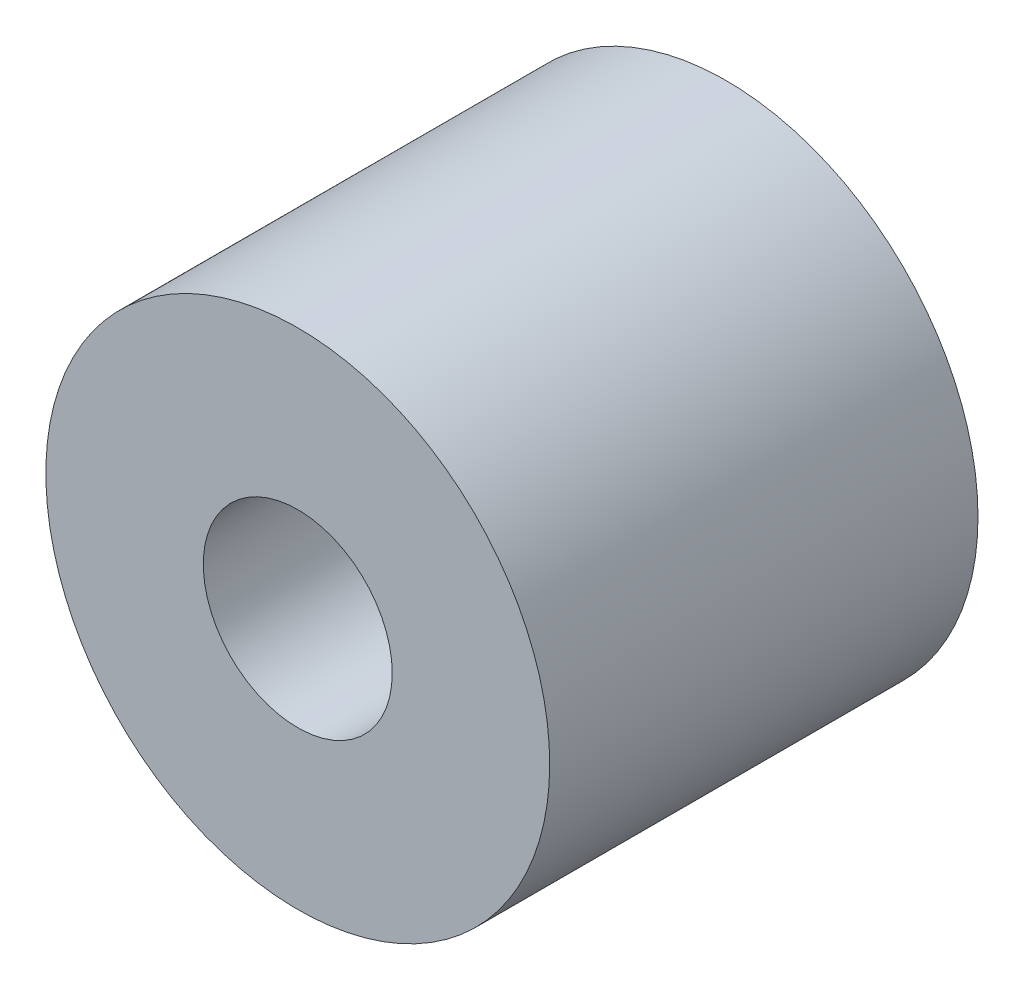
ISO-10303-21;
HEADER;
FILE_DESCRIPTION(('STEP AP214'),'2;1');
FILE_NAME('part.step','',(''),(''),'','','');
FILE_SCHEMA(('AUTOMOTIVE_DESIGN { 1 0 10303 214 1 1 1 1 }'));
ENDSEC;
DATA;
#1=APPLICATION_CONTEXT('core data for automotive mechanical design processes');
#2=APPLICATION_PROTOCOL_DEFINITION('international standard','automotive_design',2000,#1);
#3=PRODUCT_CONTEXT('',#1,'mechanical');
#4=PRODUCT('Part','Part','',(#3));
#5=PRODUCT_RELATED_PRODUCT_CATEGORY('part','',(#4));
#6=PRODUCT_DEFINITION_FORMATION('','',#4);
#7=PRODUCT_DEFINITION_CONTEXT('part definition',#1,'design');
#8=PRODUCT_DEFINITION('design','',#6,#7);
#9=PRODUCT_DEFINITION_SHAPE('','',#8);
#10=(LENGTH_UNIT() NAMED_UNIT(*) SI_UNIT(.MILLI.,.METRE.));
#11=(NAMED_UNIT(*) PLANE_ANGLE_UNIT() SI_UNIT($,.RADIAN.));
#12=(NAMED_UNIT(*) SI_UNIT($,.STERADIAN.) SOLID_ANGLE_UNIT());
#13=UNCERTAINTY_MEASURE_WITH_UNIT(LENGTH_MEASURE(1.E-05),#10,'distance_accuracy_value','');
#14=(GEOMETRIC_REPRESENTATION_CONTEXT(3) GLOBAL_UNCERTAINTY_ASSIGNED_CONTEXT((#13)) GLOBAL_UNIT_ASSIGNED_CONTEXT((#10,
#11,#12)) REPRESENTATION_CONTEXT('',''));
#15=CARTESIAN_POINT('',(0.,0.,0.));
#16=DIRECTION('',(0.,0.,1.));
#17=DIRECTION('',(1.,0.,0.));
#18=AXIS2_PLACEMENT_3D('',#15,#16,#17);
#19=CARTESIAN_POINT('',(0.,0.,21.59));
#20=DIRECTION('',(0.,0.,1.));
#21=DIRECTION('',(1.,0.,0.));
#22=AXIS2_PLACEMENT_3D('',#19,#20,#21);
#23=PLANE('',#22);
#24=CARTESIAN_POINT('',(0.,0.,21.59));
#25=DIRECTION('',(0.,0.,1.));
#26=DIRECTION('',(1.,0.,0.));
#27=AXIS2_PLACEMENT_3D('',#24,#25,#26);
#28=CIRCLE('',#27,12.7);
#29=CARTESIAN_POINT('',(12.7,0.,21.59));
#30=VERTEX_POINT('',#29);
#31=EDGE_CURVE('E10',#30,#30,#28,.T.);
#32=ORIENTED_EDGE('',*,*,#31,.T.);
#33=EDGE_LOOP('',(#32));
#34=FACE_BOUND('',#33,.T.);
#35=CARTESIAN_POINT('',(0.,0.,21.59));
#36=DIRECTION('',(0.,0.,1.));
#37=DIRECTION('',(1.,0.,0.));
#38=AXIS2_PLACEMENT_3D('',#35,#36,#37);
#39=CIRCLE('',#38,4.7625);
#40=CARTESIAN_POINT('',(4.7625,0.,21.59));
#41=VERTEX_POINT('',#40);
#42=EDGE_CURVE('E44',#41,#41,#39,.T.);
#43=ORIENTED_EDGE('',*,*,#42,.F.);
#44=EDGE_LOOP('',(#43));
#45=FACE_BOUND('',#44,.T.);
#46=ADVANCED_FACE('F33',(#34,#45),#23,.T.);
#47=CARTESIAN_POINT('',(0.,0.,0.));
#48=DIRECTION('',(0.,0.,1.));
#49=DIRECTION('',(1.,0.,0.));
#50=AXIS2_PLACEMENT_3D('',#47,#48,#49);
#51=PLANE('',#50);
#52=CARTESIAN_POINT('',(0.,0.,0.));
#53=DIRECTION('',(0.,0.,1.));
#54=DIRECTION('',(1.,0.,0.));
#55=AXIS2_PLACEMENT_3D('',#52,#53,#54);
#56=CIRCLE('',#55,12.7);
#57=CARTESIAN_POINT('',(12.7,0.,0.));
#58=VERTEX_POINT('',#57);
#59=EDGE_CURVE('E37',#58,#58,#56,.T.);
#60=ORIENTED_EDGE('',*,*,#59,.F.);
#61=EDGE_LOOP('',(#60));
#62=FACE_BOUND('',#61,.T.);
#63=CARTESIAN_POINT('',(0.,0.,0.));
#64=DIRECTION('',(0.,0.,1.));
#65=DIRECTION('',(1.,0.,0.));
#66=AXIS2_PLACEMENT_3D('',#63,#64,#65);
#67=CIRCLE('',#66,4.7625);
#68=CARTESIAN_POINT('',(4.7625,0.,0.));
#69=VERTEX_POINT('',#68);
#70=EDGE_CURVE('E46',#69,#69,#67,.T.);
#71=ORIENTED_EDGE('',*,*,#70,.T.);
#72=EDGE_LOOP('',(#71));
#73=FACE_BOUND('',#72,.T.);
#74=ADVANCED_FACE('F56',(#62,#73),#51,.F.);
#75=CARTESIAN_POINT('',(0.,0.,21.59));
#76=DIRECTION('',(0.,0.,-1.));
#77=DIRECTION('',(-1.,0.,0.));
#78=AXIS2_PLACEMENT_3D('',#75,#76,#77);
#79=CYLINDRICAL_SURFACE('',#78,12.7);
#80=ORIENTED_EDGE('',*,*,#31,.F.);
#81=EDGE_LOOP('',(#80));
#82=FACE_BOUND('',#81,.T.);
#83=ORIENTED_EDGE('',*,*,#59,.T.);
#84=EDGE_LOOP('',(#83));
#85=FACE_BOUND('',#84,.T.);
#86=ADVANCED_FACE('F35',(#82,#85),#79,.T.);
#87=CARTESIAN_POINT('',(0.,0.,21.59));
#88=DIRECTION('',(0.,0.,-1.));
#89=DIRECTION('',(-1.,0.,0.));
#90=AXIS2_PLACEMENT_3D('',#87,#88,#89);
#91=CYLINDRICAL_SURFACE('',#90,4.7625);
#92=ORIENTED_EDGE('',*,*,#42,.T.);
#93=EDGE_LOOP('',(#92));
#94=FACE_BOUND('',#93,.T.);
#95=ORIENTED_EDGE('',*,*,#70,.F.);
#96=EDGE_LOOP('',(#95));
#97=FACE_BOUND('',#96,.T.);
#98=ADVANCED_FACE('F52',(#94,#97),#91,.F.);
#99=CLOSED_SHELL('',(#46,#74,#86,#98));
#100=MANIFOLD_SOLID_BREP('B2',#99);
#101=ADVANCED_BREP_SHAPE_REPRESENTATION('',(#18,#100),#14);
#102=SHAPE_DEFINITION_REPRESENTATION(#9,#101);
ENDSEC;
END-ISO-10303-21;
